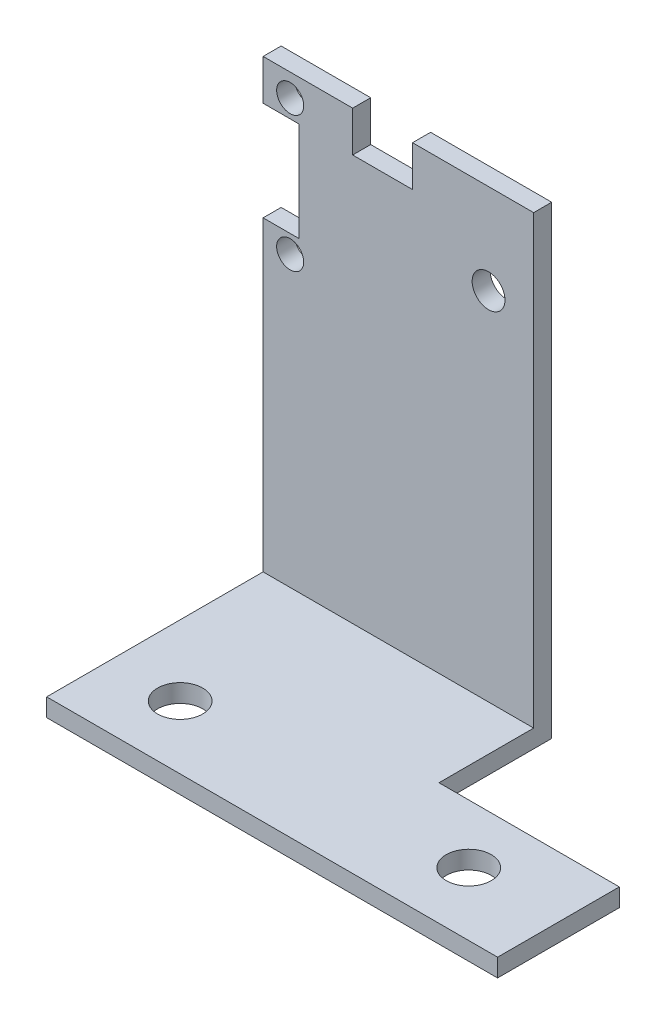
ISO-10303-21;
HEADER;
FILE_DESCRIPTION(('STEP AP214'),'2;1');
FILE_NAME('part.step','',(''),(''),'','','');
FILE_SCHEMA(('AUTOMOTIVE_DESIGN { 1 0 10303 214 1 1 1 1 }'));
ENDSEC;
DATA;
#1=APPLICATION_CONTEXT('core data for automotive mechanical design processes');
#2=APPLICATION_PROTOCOL_DEFINITION('international standard','automotive_design',2000,#1);
#3=PRODUCT_CONTEXT('',#1,'mechanical');
#4=PRODUCT('Part','Part','',(#3));
#5=PRODUCT_RELATED_PRODUCT_CATEGORY('part','',(#4));
#6=PRODUCT_DEFINITION_FORMATION('','',#4);
#7=PRODUCT_DEFINITION_CONTEXT('part definition',#1,'design');
#8=PRODUCT_DEFINITION('design','',#6,#7);
#9=PRODUCT_DEFINITION_SHAPE('','',#8);
#10=(LENGTH_UNIT() NAMED_UNIT(*) SI_UNIT(.MILLI.,.METRE.));
#11=(NAMED_UNIT(*) PLANE_ANGLE_UNIT() SI_UNIT($,.RADIAN.));
#12=(NAMED_UNIT(*) SI_UNIT($,.STERADIAN.) SOLID_ANGLE_UNIT());
#13=UNCERTAINTY_MEASURE_WITH_UNIT(LENGTH_MEASURE(1.E-05),#10,'distance_accuracy_value','');
#14=(GEOMETRIC_REPRESENTATION_CONTEXT(3) GLOBAL_UNCERTAINTY_ASSIGNED_CONTEXT((#13)) GLOBAL_UNIT_ASSIGNED_CONTEXT((#10,
#11,#12)) REPRESENTATION_CONTEXT('',''));
#15=CARTESIAN_POINT('',(0.,0.,0.));
#16=DIRECTION('',(0.,0.,1.));
#17=DIRECTION('',(1.,0.,0.));
#18=AXIS2_PLACEMENT_3D('',#15,#16,#17);
#19=CARTESIAN_POINT('',(-25.,2.,13.));
#20=DIRECTION('',(1.,0.,0.));
#21=DIRECTION('',(0.,0.,-1.));
#22=AXIS2_PLACEMENT_3D('',#19,#20,#21);
#23=PLANE('',#22);
#24=DIRECTION('',(0.,-1.,0.));
#25=VECTOR('',#24,1.);
#26=CARTESIAN_POINT('',(-25.,2.,-13.));
#27=LINE('',#26,#25);
#28=CARTESIAN_POINT('',(-25.,51.5,-13.));
#29=VERTEX_POINT('',#28);
#30=CARTESIAN_POINT('',(-25.,47.,-13.));
#31=VERTEX_POINT('',#30);
#32=EDGE_CURVE('E296',#29,#31,#27,.T.);
#33=ORIENTED_EDGE('',*,*,#32,.T.);
#34=DIRECTION('',(0.,0.,1.));
#35=VECTOR('',#34,1.);
#36=CARTESIAN_POINT('',(-25.,47.,-60.5));
#37=LINE('',#36,#35);
#38=CARTESIAN_POINT('',(-25.,47.,-11.));
#39=VERTEX_POINT('',#38);
#40=EDGE_CURVE('E188',#31,#39,#37,.T.);
#41=ORIENTED_EDGE('',*,*,#40,.T.);
#42=DIRECTION('',(0.,-1.,0.));
#43=VECTOR('',#42,1.);
#44=CARTESIAN_POINT('',(-25.,51.5,-11.));
#45=LINE('',#44,#43);
#46=CARTESIAN_POINT('',(-25.,51.5,-11.));
#47=VERTEX_POINT('',#46);
#48=EDGE_CURVE('E260',#47,#39,#45,.T.);
#49=ORIENTED_EDGE('',*,*,#48,.F.);
#50=DIRECTION('',(0.,0.,1.));
#51=VECTOR('',#50,1.);
#52=CARTESIAN_POINT('',(-25.,51.5,-13.));
#53=LINE('',#52,#51);
#54=EDGE_CURVE('E242',#29,#47,#53,.T.);
#55=ORIENTED_EDGE('',*,*,#54,.F.);
#56=EDGE_LOOP('',(#33,#41,#49,#55));
#57=FACE_BOUND('',#56,.T.);
#58=ADVANCED_FACE('F34',(#57),#23,.F.);
#59=CARTESIAN_POINT('',(0.,51.5,0.));
#60=DIRECTION('',(0.,1.,0.));
#61=DIRECTION('',(0.,0.,1.));
#62=AXIS2_PLACEMENT_3D('',#59,#60,#61);
#63=PLANE('',#62);
#64=DIRECTION('',(0.,0.,1.));
#65=VECTOR('',#64,1.);
#66=CARTESIAN_POINT('',(-15.0685863304534,51.5,0.));
#67=LINE('',#66,#65);
#68=CARTESIAN_POINT('',(-15.0685863304534,51.5,-13.));
#69=VERTEX_POINT('',#68);
#70=CARTESIAN_POINT('',(-15.0685863304534,51.5,-11.));
#71=VERTEX_POINT('',#70);
#72=EDGE_CURVE('E11',#69,#71,#67,.T.);
#73=ORIENTED_EDGE('',*,*,#72,.F.);
#74=DIRECTION('',(-1.,0.,0.));
#75=VECTOR('',#74,1.);
#76=CARTESIAN_POINT('',(-25.,51.5,-13.));
#77=LINE('',#76,#75);
#78=EDGE_CURVE('E251',#69,#29,#77,.T.);
#79=ORIENTED_EDGE('',*,*,#78,.T.);
#80=ORIENTED_EDGE('',*,*,#54,.T.);
#81=DIRECTION('',(1.,0.,0.));
#82=VECTOR('',#81,1.);
#83=CARTESIAN_POINT('',(-25.,51.5,-11.));
#84=LINE('',#83,#82);
#85=EDGE_CURVE('E246',#47,#71,#84,.T.);
#86=ORIENTED_EDGE('',*,*,#85,.T.);
#87=EDGE_LOOP('',(#73,#79,#80,#86));
#88=FACE_BOUND('',#87,.T.);
#89=ADVANCED_FACE('F334',(#88),#63,.T.);
#90=CARTESIAN_POINT('',(0.,2.,0.));
#91=DIRECTION('',(0.,-1.,0.));
#92=DIRECTION('',(0.,0.,-1.));
#93=AXIS2_PLACEMENT_3D('',#90,#91,#92);
#94=PLANE('',#93);
#95=CARTESIAN_POINT('',(-17.1976066547046,2.,6.));
#96=DIRECTION('',(0.,1.,0.));
#97=DIRECTION('',(0.,0.,1.));
#98=AXIS2_PLACEMENT_3D('',#95,#96,#97);
#99=CIRCLE('',#98,2.5);
#100=CARTESIAN_POINT('',(-17.1976066547046,2.,8.5));
#101=VERTEX_POINT('',#100);
#102=EDGE_CURVE('E264',#101,#101,#99,.T.);
#103=ORIENTED_EDGE('',*,*,#102,.F.);
#104=EDGE_LOOP('',(#103));
#105=FACE_BOUND('',#104,.T.);
#106=CARTESIAN_POINT('',(14.8023933452954,2.,6.));
#107=DIRECTION('',(0.,1.,0.));
#108=DIRECTION('',(0.,0.,1.));
#109=AXIS2_PLACEMENT_3D('',#106,#107,#108);
#110=CIRCLE('',#109,2.5);
#111=CARTESIAN_POINT('',(14.8023933452954,2.,8.5));
#112=VERTEX_POINT('',#111);
#113=EDGE_CURVE('E270',#112,#112,#110,.T.);
#114=ORIENTED_EDGE('',*,*,#113,.F.);
#115=EDGE_LOOP('',(#114));
#116=FACE_BOUND('',#115,.T.);
#117=DIRECTION('',(0.,0.,-1.));
#118=VECTOR('',#117,1.);
#119=CARTESIAN_POINT('',(25.,2.,13.));
#120=LINE('',#119,#118);
#121=CARTESIAN_POINT('',(25.,2.,13.));
#122=VERTEX_POINT('',#121);
#123=CARTESIAN_POINT('',(25.,2.,-0.499999999999997));
#124=VERTEX_POINT('',#123);
#125=EDGE_CURVE('E172',#122,#124,#120,.T.);
#126=ORIENTED_EDGE('',*,*,#125,.T.);
#127=DIRECTION('',(1.,0.,0.));
#128=VECTOR('',#127,1.);
#129=CARTESIAN_POINT('',(25.,2.,-0.499999999999997));
#130=LINE('',#129,#128);
#131=CARTESIAN_POINT('',(5.,2.,-0.499999999999995));
#132=VERTEX_POINT('',#131);
#133=EDGE_CURVE('E150',#132,#124,#130,.T.);
#134=ORIENTED_EDGE('',*,*,#133,.F.);
#135=DIRECTION('',(0.,0.,1.));
#136=VECTOR('',#135,1.);
#137=CARTESIAN_POINT('',(4.99999999999999,2.,-13.));
#138=LINE('',#137,#136);
#139=CARTESIAN_POINT('',(4.99999999999999,2.,-11.));
#140=VERTEX_POINT('',#139);
#141=EDGE_CURVE('E160',#140,#132,#138,.T.);
#142=ORIENTED_EDGE('',*,*,#141,.F.);
#143=DIRECTION('',(1.,0.,0.));
#144=VECTOR('',#143,1.);
#145=CARTESIAN_POINT('',(-25.,2.,-11.));
#146=LINE('',#145,#144);
#147=CARTESIAN_POINT('',(-25.,2.,-11.));
#148=VERTEX_POINT('',#147);
#149=EDGE_CURVE('E241',#148,#140,#146,.T.);
#150=ORIENTED_EDGE('',*,*,#149,.F.);
#151=DIRECTION('',(0.,0.,1.));
#152=VECTOR('',#151,1.);
#153=CARTESIAN_POINT('',(-25.,2.,13.));
#154=LINE('',#153,#152);
#155=CARTESIAN_POINT('',(-25.,2.,13.));
#156=VERTEX_POINT('',#155);
#157=EDGE_CURVE('E277',#148,#156,#154,.T.);
#158=ORIENTED_EDGE('',*,*,#157,.T.);
#159=DIRECTION('',(1.,0.,0.));
#160=VECTOR('',#159,1.);
#161=CARTESIAN_POINT('',(-25.,2.,13.));
#162=LINE('',#161,#160);
#163=EDGE_CURVE('E280',#156,#122,#162,.T.);
#164=ORIENTED_EDGE('',*,*,#163,.T.);
#165=EDGE_LOOP('',(#126,#134,#142,#150,#158,#164));
#166=FACE_BOUND('',#165,.T.);
#167=ADVANCED_FACE('F170',(#105,#116,#166),#94,.F.);
#168=CARTESIAN_POINT('',(0.,0.,0.));
#169=DIRECTION('',(0.,-1.,0.));
#170=DIRECTION('',(0.,0.,-1.));
#171=AXIS2_PLACEMENT_3D('',#168,#169,#170);
#172=PLANE('',#171);
#173=DIRECTION('',(-1.,0.,0.));
#174=VECTOR('',#173,1.);
#175=CARTESIAN_POINT('',(0.,0.,-0.499999999999994));
#176=LINE('',#175,#174);
#177=CARTESIAN_POINT('',(25.,0.,-0.499999999999997));
#178=VERTEX_POINT('',#177);
#179=CARTESIAN_POINT('',(5.,0.,-0.499999999999995));
#180=VERTEX_POINT('',#179);
#181=EDGE_CURVE('E153',#178,#180,#176,.T.);
#182=ORIENTED_EDGE('',*,*,#181,.F.);
#183=DIRECTION('',(0.,0.,-1.));
#184=VECTOR('',#183,1.);
#185=CARTESIAN_POINT('',(25.,0.,13.));
#186=LINE('',#185,#184);
#187=CARTESIAN_POINT('',(25.,0.,13.));
#188=VERTEX_POINT('',#187);
#189=EDGE_CURVE('E273',#188,#178,#186,.T.);
#190=ORIENTED_EDGE('',*,*,#189,.F.);
#191=DIRECTION('',(1.,0.,0.));
#192=VECTOR('',#191,1.);
#193=CARTESIAN_POINT('',(-25.,0.,13.));
#194=LINE('',#193,#192);
#195=CARTESIAN_POINT('',(-25.,0.,13.));
#196=VERTEX_POINT('',#195);
#197=EDGE_CURVE('E278',#196,#188,#194,.T.);
#198=ORIENTED_EDGE('',*,*,#197,.F.);
#199=DIRECTION('',(0.,0.,1.));
#200=VECTOR('',#199,1.);
#201=CARTESIAN_POINT('',(-25.,0.,13.));
#202=LINE('',#201,#200);
#203=CARTESIAN_POINT('',(-25.,0.,-13.));
#204=VERTEX_POINT('',#203);
#205=EDGE_CURVE('E287',#204,#196,#202,.T.);
#206=ORIENTED_EDGE('',*,*,#205,.F.);
#207=DIRECTION('',(-1.,0.,0.));
#208=VECTOR('',#207,1.);
#209=CARTESIAN_POINT('',(-25.,0.,-13.));
#210=LINE('',#209,#208);
#211=CARTESIAN_POINT('',(4.99999999999999,0.,-13.));
#212=VERTEX_POINT('',#211);
#213=EDGE_CURVE('E285',#212,#204,#210,.T.);
#214=ORIENTED_EDGE('',*,*,#213,.F.);
#215=DIRECTION('',(0.,0.,-1.));
#216=VECTOR('',#215,1.);
#217=CARTESIAN_POINT('',(5.,0.,0.));
#218=LINE('',#217,#216);
#219=EDGE_CURVE('E175',#180,#212,#218,.T.);
#220=ORIENTED_EDGE('',*,*,#219,.F.);
#221=EDGE_LOOP('',(#182,#190,#198,#206,#214,#220));
#222=FACE_BOUND('',#221,.T.);
#223=CARTESIAN_POINT('',(14.8023933452954,0.,6.));
#224=DIRECTION('',(0.,1.,0.));
#225=DIRECTION('',(0.,0.,1.));
#226=AXIS2_PLACEMENT_3D('',#223,#224,#225);
#227=CIRCLE('',#226,2.5);
#228=CARTESIAN_POINT('',(14.8023933452954,0.,8.5));
#229=VERTEX_POINT('',#228);
#230=EDGE_CURVE('E267',#229,#229,#227,.T.);
#231=ORIENTED_EDGE('',*,*,#230,.T.);
#232=EDGE_LOOP('',(#231));
#233=FACE_BOUND('',#232,.T.);
#234=CARTESIAN_POINT('',(-17.1976066547046,0.,6.));
#235=DIRECTION('',(0.,1.,0.));
#236=DIRECTION('',(0.,0.,1.));
#237=AXIS2_PLACEMENT_3D('',#234,#235,#236);
#238=CIRCLE('',#237,2.5);
#239=CARTESIAN_POINT('',(-17.1976066547046,0.,8.5));
#240=VERTEX_POINT('',#239);
#241=EDGE_CURVE('E263',#240,#240,#238,.T.);
#242=ORIENTED_EDGE('',*,*,#241,.T.);
#243=EDGE_LOOP('',(#242));
#244=FACE_BOUND('',#243,.T.);
#245=ADVANCED_FACE('F318',(#222,#233,#244),#172,.T.);
#246=CARTESIAN_POINT('',(25.,2.,13.));
#247=DIRECTION('',(-1.,0.,0.));
#248=DIRECTION('',(0.,0.,1.));
#249=AXIS2_PLACEMENT_3D('',#246,#247,#248);
#250=PLANE('',#249);
#251=ORIENTED_EDGE('',*,*,#189,.T.);
#252=DIRECTION('',(0.,1.,0.));
#253=VECTOR('',#252,1.);
#254=CARTESIAN_POINT('',(25.,-47.5,-0.499999999999997));
#255=LINE('',#254,#253);
#256=EDGE_CURVE('E157',#178,#124,#255,.T.);
#257=ORIENTED_EDGE('',*,*,#256,.T.);
#258=ORIENTED_EDGE('',*,*,#125,.F.);
#259=DIRECTION('',(0.,-1.,0.));
#260=VECTOR('',#259,1.);
#261=CARTESIAN_POINT('',(25.,2.,13.));
#262=LINE('',#261,#260);
#263=EDGE_CURVE('E282',#122,#188,#262,.T.);
#264=ORIENTED_EDGE('',*,*,#263,.T.);
#265=EDGE_LOOP('',(#251,#257,#258,#264));
#266=FACE_BOUND('',#265,.T.);
#267=ADVANCED_FACE('F36',(#266),#250,.F.);
#268=CARTESIAN_POINT('',(-25.,2.,-13.));
#269=DIRECTION('',(0.,0.,1.));
#270=DIRECTION('',(1.,0.,0.));
#271=AXIS2_PLACEMENT_3D('',#268,#269,#270);
#272=PLANE('',#271);
#273=CARTESIAN_POINT('',(-22.,34.,-13.));
#274=DIRECTION('',(0.,0.,1.));
#275=DIRECTION('',(1.,0.,0.));
#276=AXIS2_PLACEMENT_3D('',#273,#274,#275);
#277=CIRCLE('',#276,1.5);
#278=CARTESIAN_POINT('',(-20.5,34.,-13.));
#279=VERTEX_POINT('',#278);
#280=EDGE_CURVE('E238',#279,#279,#277,.T.);
#281=ORIENTED_EDGE('',*,*,#280,.T.);
#282=EDGE_LOOP('',(#281));
#283=FACE_BOUND('',#282,.T.);
#284=CARTESIAN_POINT('',(0.,41.5,-13.));
#285=DIRECTION('',(0.,0.,1.));
#286=DIRECTION('',(1.,0.,0.));
#287=AXIS2_PLACEMENT_3D('',#284,#285,#286);
#288=CIRCLE('',#287,1.82255039849977);
#289=CARTESIAN_POINT('',(1.82255039849977,41.5,-13.));
#290=VERTEX_POINT('',#289);
#291=EDGE_CURVE('E235',#290,#290,#288,.T.);
#292=ORIENTED_EDGE('',*,*,#291,.T.);
#293=EDGE_LOOP('',(#292));
#294=FACE_BOUND('',#293,.T.);
#295=DIRECTION('',(0.,-1.,0.));
#296=VECTOR('',#295,1.);
#297=CARTESIAN_POINT('',(5.,51.5,-13.));
#298=LINE('',#297,#296);
#299=CARTESIAN_POINT('',(5.,51.5,-13.));
#300=VERTEX_POINT('',#299);
#301=EDGE_CURVE('E255',#300,#212,#298,.T.);
#302=ORIENTED_EDGE('',*,*,#301,.T.);
#303=ORIENTED_EDGE('',*,*,#213,.T.);
#304=CARTESIAN_POINT('',(-25.,36.,-13.));
#305=VERTEX_POINT('',#304);
#306=EDGE_CURVE('E295',#305,#204,#27,.T.);
#307=ORIENTED_EDGE('',*,*,#306,.F.);
#308=DIRECTION('',(1.,0.,0.));
#309=VECTOR('',#308,1.);
#310=CARTESIAN_POINT('',(-25.,36.,-13.));
#311=LINE('',#310,#309);
#312=CARTESIAN_POINT('',(-21.,36.,-13.));
#313=VERTEX_POINT('',#312);
#314=EDGE_CURVE('E226',#305,#313,#311,.T.);
#315=ORIENTED_EDGE('',*,*,#314,.T.);
#316=DIRECTION('',(0.,1.,0.));
#317=VECTOR('',#316,1.);
#318=CARTESIAN_POINT('',(-21.,2.,-13.));
#319=LINE('',#318,#317);
#320=CARTESIAN_POINT('',(-21.,47.,-13.));
#321=VERTEX_POINT('',#320);
#322=EDGE_CURVE('E229',#313,#321,#319,.T.);
#323=ORIENTED_EDGE('',*,*,#322,.T.);
#324=DIRECTION('',(-1.,0.,0.));
#325=VECTOR('',#324,1.);
#326=CARTESIAN_POINT('',(-25.,47.,-13.));
#327=LINE('',#326,#325);
#328=EDGE_CURVE('E232',#321,#31,#327,.T.);
#329=ORIENTED_EDGE('',*,*,#328,.T.);
#330=ORIENTED_EDGE('',*,*,#32,.F.);
#331=ORIENTED_EDGE('',*,*,#78,.F.);
#332=DIRECTION('',(0.,-1.,0.));
#333=VECTOR('',#332,1.);
#334=CARTESIAN_POINT('',(-15.0685863304534,2.,-13.));
#335=LINE('',#334,#333);
#336=CARTESIAN_POINT('',(-15.0685863304534,47.,-13.));
#337=VERTEX_POINT('',#336);
#338=EDGE_CURVE('E217',#69,#337,#335,.T.);
#339=ORIENTED_EDGE('',*,*,#338,.T.);
#340=DIRECTION('',(1.,0.,0.));
#341=VECTOR('',#340,1.);
#342=CARTESIAN_POINT('',(-25.,47.,-13.));
#343=LINE('',#342,#341);
#344=CARTESIAN_POINT('',(-8.42929559306142,47.,-13.));
#345=VERTEX_POINT('',#344);
#346=EDGE_CURVE('E223',#337,#345,#343,.T.);
#347=ORIENTED_EDGE('',*,*,#346,.T.);
#348=DIRECTION('',(0.,1.,0.));
#349=VECTOR('',#348,1.);
#350=CARTESIAN_POINT('',(-8.42929559306142,2.,-13.));
#351=LINE('',#350,#349);
#352=CARTESIAN_POINT('',(-8.42929559306142,51.5,-13.));
#353=VERTEX_POINT('',#352);
#354=EDGE_CURVE('E214',#345,#353,#351,.T.);
#355=ORIENTED_EDGE('',*,*,#354,.T.);
#356=EDGE_CURVE('E252',#300,#353,#77,.T.);
#357=ORIENTED_EDGE('',*,*,#356,.F.);
#358=EDGE_LOOP('',(#302,#303,#307,#315,#323,#329,#330,#331,#339,#347,#355,#357));
#359=FACE_BOUND('',#358,.T.);
#360=CARTESIAN_POINT('',(-22.,49.,-13.));
#361=DIRECTION('',(0.,0.,1.));
#362=DIRECTION('',(1.,0.,0.));
#363=AXIS2_PLACEMENT_3D('',#360,#361,#362);
#364=CIRCLE('',#363,1.5);
#365=CARTESIAN_POINT('',(-20.5,49.,-13.));
#366=VERTEX_POINT('',#365);
#367=EDGE_CURVE('E220',#366,#366,#364,.T.);
#368=ORIENTED_EDGE('',*,*,#367,.T.);
#369=EDGE_LOOP('',(#368));
#370=FACE_BOUND('',#369,.T.);
#371=ADVANCED_FACE('F304',(#283,#294,#359,#370),#272,.F.);
#372=CARTESIAN_POINT('',(-25.,36.,-11.));
#373=VERTEX_POINT('',#372);
#374=EDGE_CURVE('E259',#373,#148,#45,.T.);
#375=ORIENTED_EDGE('',*,*,#374,.F.);
#376=DIRECTION('',(0.,0.,1.));
#377=VECTOR('',#376,1.);
#378=CARTESIAN_POINT('',(-25.,36.,-60.5));
#379=LINE('',#378,#377);
#380=EDGE_CURVE('E49',#305,#373,#379,.T.);
#381=ORIENTED_EDGE('',*,*,#380,.F.);
#382=ORIENTED_EDGE('',*,*,#306,.T.);
#383=ORIENTED_EDGE('',*,*,#205,.T.);
#384=DIRECTION('',(0.,-1.,0.));
#385=VECTOR('',#384,1.);
#386=CARTESIAN_POINT('',(-25.,2.,13.));
#387=LINE('',#386,#385);
#388=EDGE_CURVE('E292',#156,#196,#387,.T.);
#389=ORIENTED_EDGE('',*,*,#388,.F.);
#390=ORIENTED_EDGE('',*,*,#157,.F.);
#391=EDGE_LOOP('',(#375,#381,#382,#383,#389,#390));
#392=FACE_BOUND('',#391,.T.);
#393=ADVANCED_FACE('F315',(#392),#23,.F.);
#394=CARTESIAN_POINT('',(-25.,2.,13.));
#395=DIRECTION('',(0.,0.,-1.));
#396=DIRECTION('',(-1.,0.,0.));
#397=AXIS2_PLACEMENT_3D('',#394,#395,#396);
#398=PLANE('',#397);
#399=ORIENTED_EDGE('',*,*,#197,.T.);
#400=ORIENTED_EDGE('',*,*,#263,.F.);
#401=ORIENTED_EDGE('',*,*,#163,.F.);
#402=ORIENTED_EDGE('',*,*,#388,.T.);
#403=EDGE_LOOP('',(#399,#400,#401,#402));
#404=FACE_BOUND('',#403,.T.);
#405=ADVANCED_FACE('F323',(#404),#398,.F.);
#406=CARTESIAN_POINT('',(14.8023933452954,2.,6.));
#407=DIRECTION('',(0.,-1.,0.));
#408=DIRECTION('',(0.,0.,-1.));
#409=AXIS2_PLACEMENT_3D('',#406,#407,#408);
#410=CYLINDRICAL_SURFACE('',#409,2.5);
#411=ORIENTED_EDGE('',*,*,#113,.T.);
#412=EDGE_LOOP('',(#411));
#413=FACE_BOUND('',#412,.T.);
#414=ORIENTED_EDGE('',*,*,#230,.F.);
#415=EDGE_LOOP('',(#414));
#416=FACE_BOUND('',#415,.T.);
#417=ADVANCED_FACE('F347',(#413,#416),#410,.F.);
#418=CARTESIAN_POINT('',(-17.1976066547046,2.,6.));
#419=DIRECTION('',(0.,-1.,0.));
#420=DIRECTION('',(0.,0.,-1.));
#421=AXIS2_PLACEMENT_3D('',#418,#419,#420);
#422=CYLINDRICAL_SURFACE('',#421,2.5);
#423=ORIENTED_EDGE('',*,*,#102,.T.);
#424=EDGE_LOOP('',(#423));
#425=FACE_BOUND('',#424,.T.);
#426=ORIENTED_EDGE('',*,*,#241,.F.);
#427=EDGE_LOOP('',(#426));
#428=FACE_BOUND('',#427,.T.);
#429=ADVANCED_FACE('F351',(#425,#428),#422,.F.);
#430=CARTESIAN_POINT('',(-25.,51.5,-11.));
#431=DIRECTION('',(0.,0.,-1.));
#432=DIRECTION('',(-1.,0.,0.));
#433=AXIS2_PLACEMENT_3D('',#430,#431,#432);
#434=PLANE('',#433);
#435=CARTESIAN_POINT('',(-22.,34.,-11.));
#436=DIRECTION('',(0.,0.,1.));
#437=DIRECTION('',(1.,0.,0.));
#438=AXIS2_PLACEMENT_3D('',#435,#436,#437);
#439=CIRCLE('',#438,1.5);
#440=CARTESIAN_POINT('',(-20.5,34.,-11.));
#441=VERTEX_POINT('',#440);
#442=EDGE_CURVE('E206',#441,#441,#439,.T.);
#443=ORIENTED_EDGE('',*,*,#442,.F.);
#444=EDGE_LOOP('',(#443));
#445=FACE_BOUND('',#444,.T.);
#446=CARTESIAN_POINT('',(0.,41.5,-11.));
#447=DIRECTION('',(0.,0.,1.));
#448=DIRECTION('',(1.,0.,0.));
#449=AXIS2_PLACEMENT_3D('',#446,#447,#448);
#450=CIRCLE('',#449,1.82255039849977);
#451=CARTESIAN_POINT('',(1.82255039849977,41.5,-11.));
#452=VERTEX_POINT('',#451);
#453=EDGE_CURVE('E191',#452,#452,#450,.T.);
#454=ORIENTED_EDGE('',*,*,#453,.F.);
#455=EDGE_LOOP('',(#454));
#456=FACE_BOUND('',#455,.T.);
#457=CARTESIAN_POINT('',(-22.,49.,-11.));
#458=DIRECTION('',(0.,0.,1.));
#459=DIRECTION('',(1.,0.,0.));
#460=AXIS2_PLACEMENT_3D('',#457,#458,#459);
#461=CIRCLE('',#460,1.5);
#462=CARTESIAN_POINT('',(-20.5,49.,-11.));
#463=VERTEX_POINT('',#462);
#464=EDGE_CURVE('E209',#463,#463,#461,.T.);
#465=ORIENTED_EDGE('',*,*,#464,.F.);
#466=EDGE_LOOP('',(#465));
#467=FACE_BOUND('',#466,.T.);
#468=ORIENTED_EDGE('',*,*,#48,.T.);
#469=DIRECTION('',(-1.,0.,0.));
#470=VECTOR('',#469,1.);
#471=CARTESIAN_POINT('',(-25.,47.,-11.));
#472=LINE('',#471,#470);
#473=CARTESIAN_POINT('',(-21.,47.,-11.));
#474=VERTEX_POINT('',#473);
#475=EDGE_CURVE('E186',#474,#39,#472,.T.);
#476=ORIENTED_EDGE('',*,*,#475,.F.);
#477=DIRECTION('',(0.,1.,0.));
#478=VECTOR('',#477,1.);
#479=CARTESIAN_POINT('',(-21.,47.,-11.));
#480=LINE('',#479,#478);
#481=CARTESIAN_POINT('',(-21.,36.,-11.));
#482=VERTEX_POINT('',#481);
#483=EDGE_CURVE('E182',#482,#474,#480,.T.);
#484=ORIENTED_EDGE('',*,*,#483,.F.);
#485=DIRECTION('',(1.,0.,0.));
#486=VECTOR('',#485,1.);
#487=CARTESIAN_POINT('',(-25.,36.,-11.));
#488=LINE('',#487,#486);
#489=EDGE_CURVE('E180',#373,#482,#488,.T.);
#490=ORIENTED_EDGE('',*,*,#489,.F.);
#491=ORIENTED_EDGE('',*,*,#374,.T.);
#492=ORIENTED_EDGE('',*,*,#149,.T.);
#493=DIRECTION('',(0.,-1.,0.));
#494=VECTOR('',#493,1.);
#495=CARTESIAN_POINT('',(5.,51.5,-11.));
#496=LINE('',#495,#494);
#497=CARTESIAN_POINT('',(5.,51.5,-11.));
#498=VERTEX_POINT('',#497);
#499=EDGE_CURVE('E164',#498,#140,#496,.T.);
#500=ORIENTED_EDGE('',*,*,#499,.F.);
#501=CARTESIAN_POINT('',(-8.42929559306142,51.5,-11.));
#502=VERTEX_POINT('',#501);
#503=EDGE_CURVE('E245',#502,#498,#84,.T.);
#504=ORIENTED_EDGE('',*,*,#503,.F.);
#505=DIRECTION('',(0.,1.,0.));
#506=VECTOR('',#505,1.);
#507=CARTESIAN_POINT('',(-8.42929559306142,51.5,-11.));
#508=LINE('',#507,#506);
#509=CARTESIAN_POINT('',(-8.42929559306142,47.,-11.));
#510=VERTEX_POINT('',#509);
#511=EDGE_CURVE('E57',#510,#502,#508,.T.);
#512=ORIENTED_EDGE('',*,*,#511,.F.);
#513=DIRECTION('',(1.,0.,0.));
#514=VECTOR('',#513,1.);
#515=CARTESIAN_POINT('',(-15.0685863304534,47.,-11.));
#516=LINE('',#515,#514);
#517=CARTESIAN_POINT('',(-15.0685863304534,47.,-11.));
#518=VERTEX_POINT('',#517);
#519=EDGE_CURVE('E199',#518,#510,#516,.T.);
#520=ORIENTED_EDGE('',*,*,#519,.F.);
#521=DIRECTION('',(0.,-1.,0.));
#522=VECTOR('',#521,1.);
#523=CARTESIAN_POINT('',(-15.0685863304534,51.5,-11.));
#524=LINE('',#523,#522);
#525=EDGE_CURVE('E179',#71,#518,#524,.T.);
#526=ORIENTED_EDGE('',*,*,#525,.F.);
#527=ORIENTED_EDGE('',*,*,#85,.F.);
#528=EDGE_LOOP('',(#468,#476,#484,#490,#491,#492,#500,#504,#512,#520,#526,#527));
#529=FACE_BOUND('',#528,.T.);
#530=ADVANCED_FACE('F360',(#445,#456,#467,#529),#434,.F.);
#531=CARTESIAN_POINT('',(5.,51.5,-13.));
#532=DIRECTION('',(-1.,0.,0.));
#533=DIRECTION('',(0.,0.,1.));
#534=AXIS2_PLACEMENT_3D('',#531,#532,#533);
#535=PLANE('',#534);
#536=ORIENTED_EDGE('',*,*,#499,.T.);
#537=ORIENTED_EDGE('',*,*,#141,.T.);
#538=DIRECTION('',(0.,1.,0.));
#539=VECTOR('',#538,1.);
#540=CARTESIAN_POINT('',(5.,-47.5,-0.499999999999995));
#541=LINE('',#540,#539);
#542=EDGE_CURVE('E146',#180,#132,#541,.T.);
#543=ORIENTED_EDGE('',*,*,#542,.F.);
#544=ORIENTED_EDGE('',*,*,#219,.T.);
#545=ORIENTED_EDGE('',*,*,#301,.F.);
#546=DIRECTION('',(0.,0.,-1.));
#547=VECTOR('',#546,1.);
#548=CARTESIAN_POINT('',(5.,51.5,-13.));
#549=LINE('',#548,#547);
#550=EDGE_CURVE('E249',#498,#300,#549,.T.);
#551=ORIENTED_EDGE('',*,*,#550,.F.);
#552=EDGE_LOOP('',(#536,#537,#543,#544,#545,#551));
#553=FACE_BOUND('',#552,.T.);
#554=ADVANCED_FACE('F161',(#553),#535,.F.);
#555=DIRECTION('',(0.,0.,-1.));
#556=VECTOR('',#555,1.);
#557=CARTESIAN_POINT('',(-8.42929559306142,51.5,0.));
#558=LINE('',#557,#556);
#559=EDGE_CURVE('E42',#502,#353,#558,.T.);
#560=ORIENTED_EDGE('',*,*,#559,.F.);
#561=ORIENTED_EDGE('',*,*,#503,.T.);
#562=ORIENTED_EDGE('',*,*,#550,.T.);
#563=ORIENTED_EDGE('',*,*,#356,.T.);
#564=EDGE_LOOP('',(#560,#561,#562,#563));
#565=FACE_BOUND('',#564,.T.);
#566=ADVANCED_FACE('F306',(#565),#63,.T.);
#567=CARTESIAN_POINT('',(-15.0685863304534,47.,-60.5));
#568=DIRECTION('',(0.,-1.,0.));
#569=DIRECTION('',(0.,0.,-1.));
#570=AXIS2_PLACEMENT_3D('',#567,#568,#569);
#571=PLANE('',#570);
#572=DIRECTION('',(0.,0.,1.));
#573=VECTOR('',#572,1.);
#574=CARTESIAN_POINT('',(-15.0685863304534,47.,-60.5));
#575=LINE('',#574,#573);
#576=EDGE_CURVE('E203',#337,#518,#575,.T.);
#577=ORIENTED_EDGE('',*,*,#576,.T.);
#578=ORIENTED_EDGE('',*,*,#519,.T.);
#579=DIRECTION('',(0.,0.,1.));
#580=VECTOR('',#579,1.);
#581=CARTESIAN_POINT('',(-8.42929559306142,47.,-60.5));
#582=LINE('',#581,#580);
#583=EDGE_CURVE('E183',#345,#510,#582,.T.);
#584=ORIENTED_EDGE('',*,*,#583,.F.);
#585=ORIENTED_EDGE('',*,*,#346,.F.);
#586=EDGE_LOOP('',(#577,#578,#584,#585));
#587=FACE_BOUND('',#586,.T.);
#588=ADVANCED_FACE('F368',(#587),#571,.F.);
#589=CARTESIAN_POINT('',(-15.0685863304534,51.5,-60.5));
#590=DIRECTION('',(-1.,0.,0.));
#591=DIRECTION('',(0.,0.,1.));
#592=AXIS2_PLACEMENT_3D('',#589,#590,#591);
#593=PLANE('',#592);
#594=ORIENTED_EDGE('',*,*,#72,.T.);
#595=ORIENTED_EDGE('',*,*,#525,.T.);
#596=ORIENTED_EDGE('',*,*,#576,.F.);
#597=ORIENTED_EDGE('',*,*,#338,.F.);
#598=EDGE_LOOP('',(#594,#595,#596,#597));
#599=FACE_BOUND('',#598,.T.);
#600=ADVANCED_FACE('F383',(#599),#593,.F.);
#601=CARTESIAN_POINT('',(-8.42929559306142,51.5,-60.5));
#602=DIRECTION('',(1.,0.,0.));
#603=DIRECTION('',(0.,0.,-1.));
#604=AXIS2_PLACEMENT_3D('',#601,#602,#603);
#605=PLANE('',#604);
#606=ORIENTED_EDGE('',*,*,#583,.T.);
#607=ORIENTED_EDGE('',*,*,#511,.T.);
#608=ORIENTED_EDGE('',*,*,#559,.T.);
#609=ORIENTED_EDGE('',*,*,#354,.F.);
#610=EDGE_LOOP('',(#606,#607,#608,#609));
#611=FACE_BOUND('',#610,.T.);
#612=ADVANCED_FACE('F298',(#611),#605,.F.);
#613=CARTESIAN_POINT('',(-22.,49.,-60.5));
#614=DIRECTION('',(0.,0.,1.));
#615=DIRECTION('',(1.,0.,0.));
#616=AXIS2_PLACEMENT_3D('',#613,#614,#615);
#617=CYLINDRICAL_SURFACE('',#616,1.5);
#618=ORIENTED_EDGE('',*,*,#464,.T.);
#619=EDGE_LOOP('',(#618));
#620=FACE_BOUND('',#619,.T.);
#621=ORIENTED_EDGE('',*,*,#367,.F.);
#622=EDGE_LOOP('',(#621));
#623=FACE_BOUND('',#622,.T.);
#624=ADVANCED_FACE('F369',(#620,#623),#617,.F.);
#625=CARTESIAN_POINT('',(-25.,47.,-60.5));
#626=DIRECTION('',(0.,1.,0.));
#627=DIRECTION('',(0.,0.,1.));
#628=AXIS2_PLACEMENT_3D('',#625,#626,#627);
#629=PLANE('',#628);
#630=DIRECTION('',(0.,0.,1.));
#631=VECTOR('',#630,1.);
#632=CARTESIAN_POINT('',(-21.,47.,-60.5));
#633=LINE('',#632,#631);
#634=EDGE_CURVE('E192',#321,#474,#633,.T.);
#635=ORIENTED_EDGE('',*,*,#634,.T.);
#636=ORIENTED_EDGE('',*,*,#475,.T.);
#637=ORIENTED_EDGE('',*,*,#40,.F.);
#638=ORIENTED_EDGE('',*,*,#328,.F.);
#639=EDGE_LOOP('',(#635,#636,#637,#638));
#640=FACE_BOUND('',#639,.T.);
#641=ADVANCED_FACE('F372',(#640),#629,.F.);
#642=CARTESIAN_POINT('',(-21.,47.,-60.5));
#643=DIRECTION('',(1.,0.,0.));
#644=DIRECTION('',(0.,0.,-1.));
#645=AXIS2_PLACEMENT_3D('',#642,#643,#644);
#646=PLANE('',#645);
#647=DIRECTION('',(0.,0.,1.));
#648=VECTOR('',#647,1.);
#649=CARTESIAN_POINT('',(-21.,36.,-60.5));
#650=LINE('',#649,#648);
#651=EDGE_CURVE('E194',#313,#482,#650,.T.);
#652=ORIENTED_EDGE('',*,*,#651,.T.);
#653=ORIENTED_EDGE('',*,*,#483,.T.);
#654=ORIENTED_EDGE('',*,*,#634,.F.);
#655=ORIENTED_EDGE('',*,*,#322,.F.);
#656=EDGE_LOOP('',(#652,#653,#654,#655));
#657=FACE_BOUND('',#656,.T.);
#658=ADVANCED_FACE('F394',(#657),#646,.F.);
#659=CARTESIAN_POINT('',(-25.,36.,-60.5));
#660=DIRECTION('',(0.,-1.,0.));
#661=DIRECTION('',(0.,0.,-1.));
#662=AXIS2_PLACEMENT_3D('',#659,#660,#661);
#663=PLANE('',#662);
#664=ORIENTED_EDGE('',*,*,#380,.T.);
#665=ORIENTED_EDGE('',*,*,#489,.T.);
#666=ORIENTED_EDGE('',*,*,#651,.F.);
#667=ORIENTED_EDGE('',*,*,#314,.F.);
#668=EDGE_LOOP('',(#664,#665,#666,#667));
#669=FACE_BOUND('',#668,.T.);
#670=ADVANCED_FACE('F378',(#669),#663,.F.);
#671=CARTESIAN_POINT('',(0.,41.5,-60.5));
#672=DIRECTION('',(0.,0.,1.));
#673=DIRECTION('',(1.,0.,0.));
#674=AXIS2_PLACEMENT_3D('',#671,#672,#673);
#675=CYLINDRICAL_SURFACE('',#674,1.82255039849977);
#676=ORIENTED_EDGE('',*,*,#453,.T.);
#677=EDGE_LOOP('',(#676));
#678=FACE_BOUND('',#677,.T.);
#679=ORIENTED_EDGE('',*,*,#291,.F.);
#680=EDGE_LOOP('',(#679));
#681=FACE_BOUND('',#680,.T.);
#682=ADVANCED_FACE('F374',(#678,#681),#675,.F.);
#683=CARTESIAN_POINT('',(-22.,34.,-60.5));
#684=DIRECTION('',(0.,0.,1.));
#685=DIRECTION('',(1.,0.,0.));
#686=AXIS2_PLACEMENT_3D('',#683,#684,#685);
#687=CYLINDRICAL_SURFACE('',#686,1.5);
#688=ORIENTED_EDGE('',*,*,#442,.T.);
#689=EDGE_LOOP('',(#688));
#690=FACE_BOUND('',#689,.T.);
#691=ORIENTED_EDGE('',*,*,#280,.F.);
#692=EDGE_LOOP('',(#691));
#693=FACE_BOUND('',#692,.T.);
#694=ADVANCED_FACE('F377',(#690,#693),#687,.F.);
#695=CARTESIAN_POINT('',(25.,-47.5,-0.499999999999997));
#696=DIRECTION('',(0.,0.,1.));
#697=DIRECTION('',(1.,0.,0.));
#698=AXIS2_PLACEMENT_3D('',#695,#696,#697);
#699=PLANE('',#698);
#700=ORIENTED_EDGE('',*,*,#181,.T.);
#701=ORIENTED_EDGE('',*,*,#542,.T.);
#702=ORIENTED_EDGE('',*,*,#133,.T.);
#703=ORIENTED_EDGE('',*,*,#256,.F.);
#704=EDGE_LOOP('',(#700,#701,#702,#703));
#705=FACE_BOUND('',#704,.T.);
#706=ADVANCED_FACE('F148',(#705),#699,.F.);
#707=CLOSED_SHELL('',(#58,#89,#167,#245,#267,#371,#393,#405,#417,#429,#530,#554,#566,#588,#600,
#612,#624,#641,#658,#670,#682,#694,#706));
#708=MANIFOLD_SOLID_BREP('B2',#707);
#709=ADVANCED_BREP_SHAPE_REPRESENTATION('',(#18,#708),#14);
#710=SHAPE_DEFINITION_REPRESENTATION(#9,#709);
ENDSEC;
END-ISO-10303-21;
